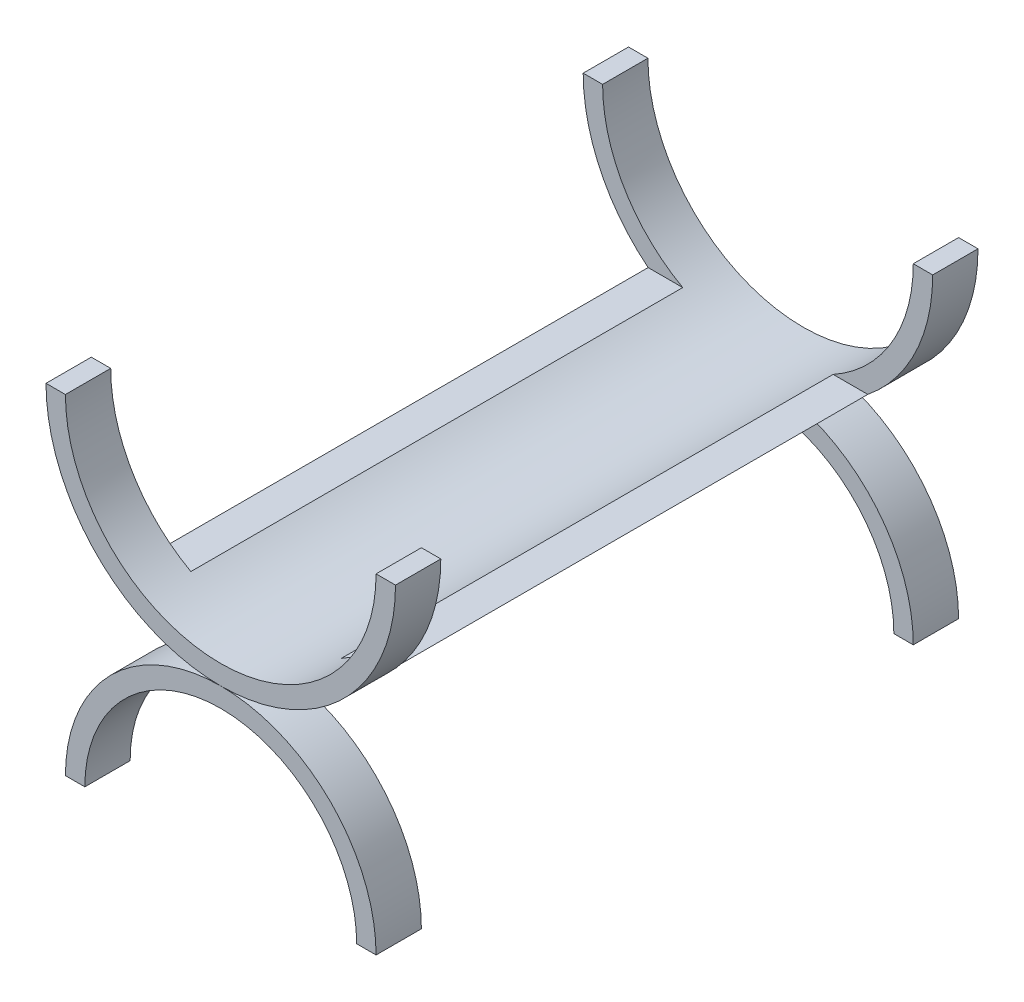
ISO-10303-21;
HEADER;
FILE_DESCRIPTION(('STEP AP214'),'2;1');
FILE_NAME('part.step','',(''),(''),'','','');
FILE_SCHEMA(('AUTOMOTIVE_DESIGN { 1 0 10303 214 1 1 1 1 }'));
ENDSEC;
DATA;
#1=APPLICATION_CONTEXT('core data for automotive mechanical design processes');
#2=APPLICATION_PROTOCOL_DEFINITION('international standard','automotive_design',2000,#1);
#3=PRODUCT_CONTEXT('',#1,'mechanical');
#4=PRODUCT('Part','Part','',(#3));
#5=PRODUCT_RELATED_PRODUCT_CATEGORY('part','',(#4));
#6=PRODUCT_DEFINITION_FORMATION('','',#4);
#7=PRODUCT_DEFINITION_CONTEXT('part definition',#1,'design');
#8=PRODUCT_DEFINITION('design','',#6,#7);
#9=PRODUCT_DEFINITION_SHAPE('','',#8);
#10=(LENGTH_UNIT() NAMED_UNIT(*) SI_UNIT(.MILLI.,.METRE.));
#11=(NAMED_UNIT(*) PLANE_ANGLE_UNIT() SI_UNIT($,.RADIAN.));
#12=(NAMED_UNIT(*) SI_UNIT($,.STERADIAN.) SOLID_ANGLE_UNIT());
#13=UNCERTAINTY_MEASURE_WITH_UNIT(LENGTH_MEASURE(1.E-05),#10,'distance_accuracy_value','');
#14=(GEOMETRIC_REPRESENTATION_CONTEXT(3) GLOBAL_UNCERTAINTY_ASSIGNED_CONTEXT((#13)) GLOBAL_UNIT_ASSIGNED_CONTEXT((#10,
#11,#12)) REPRESENTATION_CONTEXT('',''));
#15=CARTESIAN_POINT('',(0.,0.,0.));
#16=DIRECTION('',(0.,0.,1.));
#17=DIRECTION('',(1.,0.,0.));
#18=AXIS2_PLACEMENT_3D('',#15,#16,#17);
#19=CARTESIAN_POINT('',(0.,-647.7,-482.6));
#20=DIRECTION('',(0.,0.,-1.));
#21=DIRECTION('',(1.,0.,0.));
#22=AXIS2_PLACEMENT_3D('',#19,#20,#21);
#23=CYLINDRICAL_SURFACE('',#22,304.8);
#24=CARTESIAN_POINT('',(0.,-647.7,-571.5));
#25=DIRECTION('',(0.,0.,1.));
#26=DIRECTION('',(-1.,0.,0.));
#27=AXIS2_PLACEMENT_3D('',#24,#25,#26);
#28=CIRCLE('',#27,304.8);
#29=CARTESIAN_POINT('',(304.8,-647.7,-571.5));
#30=VERTEX_POINT('',#29);
#31=CARTESIAN_POINT('',(-304.8,-647.7,-571.5));
#32=VERTEX_POINT('',#31);
#33=EDGE_CURVE('E120',#30,#32,#28,.T.);
#34=ORIENTED_EDGE('',*,*,#33,.T.);
#35=DIRECTION('',(0.,0.,-1.));
#36=VECTOR('',#35,1.);
#37=CARTESIAN_POINT('',(-304.8,-647.7,-482.6));
#38=LINE('',#37,#36);
#39=CARTESIAN_POINT('',(-304.8,-647.7,-482.6));
#40=VERTEX_POINT('',#39);
#41=EDGE_CURVE('E59',#40,#32,#38,.T.);
#42=ORIENTED_EDGE('',*,*,#41,.F.);
#43=CARTESIAN_POINT('',(0.,-647.7,-482.6));
#44=DIRECTION('',(0.,0.,1.));
#45=DIRECTION('',(-1.,0.,0.));
#46=AXIS2_PLACEMENT_3D('',#43,#44,#45);
#47=CIRCLE('',#46,304.8);
#48=CARTESIAN_POINT('',(304.8,-647.7,-482.6));
#49=VERTEX_POINT('',#48);
#50=EDGE_CURVE('E109',#49,#40,#47,.T.);
#51=ORIENTED_EDGE('',*,*,#50,.F.);
#52=DIRECTION('',(0.,0.,-1.));
#53=VECTOR('',#52,1.);
#54=CARTESIAN_POINT('',(304.8,-647.7,-482.6));
#55=LINE('',#54,#53);
#56=EDGE_CURVE('E12',#49,#30,#55,.T.);
#57=ORIENTED_EDGE('',*,*,#56,.T.);
#58=EDGE_LOOP('',(#34,#42,#51,#57));
#59=FACE_BOUND('',#58,.T.);
#60=ADVANCED_FACE('F56',(#59),#23,.T.);
#61=CARTESIAN_POINT('',(266.7,-647.7,-482.6));
#62=DIRECTION('',(0.,-1.,0.));
#63=DIRECTION('',(0.,0.,1.));
#64=AXIS2_PLACEMENT_3D('',#61,#62,#63);
#65=PLANE('',#64);
#66=DIRECTION('',(1.,0.,0.));
#67=VECTOR('',#66,1.);
#68=CARTESIAN_POINT('',(266.7,-647.7,-571.5));
#69=LINE('',#68,#67);
#70=CARTESIAN_POINT('',(266.7,-647.7,-571.5));
#71=VERTEX_POINT('',#70);
#72=EDGE_CURVE('E97',#71,#30,#69,.T.);
#73=ORIENTED_EDGE('',*,*,#72,.T.);
#74=ORIENTED_EDGE('',*,*,#56,.F.);
#75=DIRECTION('',(1.,0.,0.));
#76=VECTOR('',#75,1.);
#77=CARTESIAN_POINT('',(266.7,-647.7,-482.6));
#78=LINE('',#77,#76);
#79=CARTESIAN_POINT('',(266.7,-647.7,-482.6));
#80=VERTEX_POINT('',#79);
#81=EDGE_CURVE('E74',#80,#49,#78,.T.);
#82=ORIENTED_EDGE('',*,*,#81,.F.);
#83=DIRECTION('',(0.,0.,-1.));
#84=VECTOR('',#83,1.);
#85=CARTESIAN_POINT('',(266.7,-647.7,-482.6));
#86=LINE('',#85,#84);
#87=EDGE_CURVE('E65',#80,#71,#86,.T.);
#88=ORIENTED_EDGE('',*,*,#87,.T.);
#89=EDGE_LOOP('',(#73,#74,#82,#88));
#90=FACE_BOUND('',#89,.T.);
#91=ADVANCED_FACE('F126',(#90),#65,.T.);
#92=CARTESIAN_POINT('',(0.,-647.7,-482.6));
#93=DIRECTION('',(0.,0.,-1.));
#94=DIRECTION('',(1.,0.,0.));
#95=AXIS2_PLACEMENT_3D('',#92,#93,#94);
#96=CYLINDRICAL_SURFACE('',#95,266.7);
#97=CARTESIAN_POINT('',(0.,-647.7,-571.5));
#98=DIRECTION('',(0.,0.,-1.));
#99=DIRECTION('',(-1.,0.,0.));
#100=AXIS2_PLACEMENT_3D('',#97,#98,#99);
#101=CIRCLE('',#100,266.7);
#102=CARTESIAN_POINT('',(-266.7,-647.7,-571.5));
#103=VERTEX_POINT('',#102);
#104=EDGE_CURVE('E91',#103,#71,#101,.T.);
#105=ORIENTED_EDGE('',*,*,#104,.T.);
#106=ORIENTED_EDGE('',*,*,#87,.F.);
#107=CARTESIAN_POINT('',(0.,-647.7,-482.6));
#108=DIRECTION('',(0.,0.,-1.));
#109=DIRECTION('',(-1.,0.,0.));
#110=AXIS2_PLACEMENT_3D('',#107,#108,#109);
#111=CIRCLE('',#110,266.7);
#112=CARTESIAN_POINT('',(-266.7,-647.7,-482.6));
#113=VERTEX_POINT('',#112);
#114=EDGE_CURVE('E107',#113,#80,#111,.T.);
#115=ORIENTED_EDGE('',*,*,#114,.F.);
#116=DIRECTION('',(0.,0.,-1.));
#117=VECTOR('',#116,1.);
#118=CARTESIAN_POINT('',(-266.7,-647.7,-482.6));
#119=LINE('',#118,#117);
#120=EDGE_CURVE('E112',#113,#103,#119,.T.);
#121=ORIENTED_EDGE('',*,*,#120,.T.);
#122=EDGE_LOOP('',(#105,#106,#115,#121));
#123=FACE_BOUND('',#122,.T.);
#124=ADVANCED_FACE('F115',(#123),#96,.F.);
#125=CARTESIAN_POINT('',(-304.8,-647.7,-482.6));
#126=DIRECTION('',(0.,-1.,0.));
#127=DIRECTION('',(0.,0.,1.));
#128=AXIS2_PLACEMENT_3D('',#125,#126,#127);
#129=PLANE('',#128);
#130=DIRECTION('',(1.,0.,0.));
#131=VECTOR('',#130,1.);
#132=CARTESIAN_POINT('',(-304.8,-647.7,-571.5));
#133=LINE('',#132,#131);
#134=EDGE_CURVE('E114',#32,#103,#133,.T.);
#135=ORIENTED_EDGE('',*,*,#134,.T.);
#136=ORIENTED_EDGE('',*,*,#120,.F.);
#137=DIRECTION('',(1.,0.,0.));
#138=VECTOR('',#137,1.);
#139=CARTESIAN_POINT('',(-304.8,-647.7,-482.6));
#140=LINE('',#139,#138);
#141=EDGE_CURVE('E104',#40,#113,#140,.T.);
#142=ORIENTED_EDGE('',*,*,#141,.F.);
#143=ORIENTED_EDGE('',*,*,#41,.T.);
#144=EDGE_LOOP('',(#135,#136,#142,#143));
#145=FACE_BOUND('',#144,.T.);
#146=ADVANCED_FACE('F113',(#145),#129,.T.);
#147=CARTESIAN_POINT('',(0.,-647.7,-482.6));
#148=DIRECTION('',(0.,0.,1.));
#149=DIRECTION('',(-1.,0.,0.));
#150=AXIS2_PLACEMENT_3D('',#147,#148,#149);
#151=PLANE('',#150);
#152=ORIENTED_EDGE('',*,*,#50,.T.);
#153=ORIENTED_EDGE('',*,*,#141,.T.);
#154=ORIENTED_EDGE('',*,*,#114,.T.);
#155=ORIENTED_EDGE('',*,*,#81,.T.);
#156=EDGE_LOOP('',(#152,#153,#154,#155));
#157=FACE_BOUND('',#156,.T.);
#158=ADVANCED_FACE('F105',(#157),#151,.T.);
#159=CARTESIAN_POINT('',(0.,-647.7,-571.5));
#160=DIRECTION('',(0.,0.,1.));
#161=DIRECTION('',(-1.,0.,0.));
#162=AXIS2_PLACEMENT_3D('',#159,#160,#161);
#163=PLANE('',#162);
#164=ORIENTED_EDGE('',*,*,#33,.F.);
#165=ORIENTED_EDGE('',*,*,#72,.F.);
#166=ORIENTED_EDGE('',*,*,#104,.F.);
#167=ORIENTED_EDGE('',*,*,#134,.F.);
#168=EDGE_LOOP('',(#164,#165,#166,#167));
#169=FACE_BOUND('',#168,.T.);
#170=ADVANCED_FACE('F129',(#169),#163,.F.);
#171=CLOSED_SHELL('',(#60,#91,#124,#146,#158,#170));
#172=MANIFOLD_SOLID_BREP('B2',#171);
#173=CARTESIAN_POINT('',(0.,-647.7,482.6));
#174=DIRECTION('',(0.,0.,1.));
#175=DIRECTION('',(1.,0.,0.));
#176=AXIS2_PLACEMENT_3D('',#173,#174,#175);
#177=CYLINDRICAL_SURFACE('',#176,304.8);
#178=CARTESIAN_POINT('',(0.,-647.7,571.5));
#179=DIRECTION('',(0.,0.,1.));
#180=DIRECTION('',(-1.,0.,0.));
#181=AXIS2_PLACEMENT_3D('',#178,#179,#180);
#182=CIRCLE('',#181,304.8);
#183=CARTESIAN_POINT('',(304.8,-647.7,571.5));
#184=VERTEX_POINT('',#183);
#185=CARTESIAN_POINT('',(-304.8,-647.7,571.5));
#186=VERTEX_POINT('',#185);
#187=EDGE_CURVE('E253',#184,#186,#182,.T.);
#188=ORIENTED_EDGE('',*,*,#187,.F.);
#189=DIRECTION('',(0.,0.,1.));
#190=VECTOR('',#189,1.);
#191=CARTESIAN_POINT('',(304.8,-647.7,482.6));
#192=LINE('',#191,#190);
#193=CARTESIAN_POINT('',(304.8,-647.7,482.6));
#194=VERTEX_POINT('',#193);
#195=EDGE_CURVE('E54',#194,#184,#192,.T.);
#196=ORIENTED_EDGE('',*,*,#195,.F.);
#197=CARTESIAN_POINT('',(0.,-647.7,482.6));
#198=DIRECTION('',(0.,0.,1.));
#199=DIRECTION('',(-1.,0.,0.));
#200=AXIS2_PLACEMENT_3D('',#197,#198,#199);
#201=CIRCLE('',#200,304.8);
#202=CARTESIAN_POINT('',(-304.8,-647.7,482.6));
#203=VERTEX_POINT('',#202);
#204=EDGE_CURVE('E247',#194,#203,#201,.T.);
#205=ORIENTED_EDGE('',*,*,#204,.T.);
#206=DIRECTION('',(0.,0.,1.));
#207=VECTOR('',#206,1.);
#208=CARTESIAN_POINT('',(-304.8,-647.7,482.6));
#209=LINE('',#208,#207);
#210=EDGE_CURVE('E192',#203,#186,#209,.T.);
#211=ORIENTED_EDGE('',*,*,#210,.T.);
#212=EDGE_LOOP('',(#188,#196,#205,#211));
#213=FACE_BOUND('',#212,.T.);
#214=ADVANCED_FACE('F189',(#213),#177,.T.);
#215=CARTESIAN_POINT('',(266.7,-647.7,482.6));
#216=DIRECTION('',(0.,-1.,0.));
#217=DIRECTION('',(0.,0.,-1.));
#218=AXIS2_PLACEMENT_3D('',#215,#216,#217);
#219=PLANE('',#218);
#220=DIRECTION('',(1.,0.,0.));
#221=VECTOR('',#220,1.);
#222=CARTESIAN_POINT('',(266.7,-647.7,571.5));
#223=LINE('',#222,#221);
#224=CARTESIAN_POINT('',(266.7,-647.7,571.5));
#225=VERTEX_POINT('',#224);
#226=EDGE_CURVE('E249',#225,#184,#223,.T.);
#227=ORIENTED_EDGE('',*,*,#226,.F.);
#228=DIRECTION('',(0.,0.,1.));
#229=VECTOR('',#228,1.);
#230=CARTESIAN_POINT('',(266.7,-647.7,482.6));
#231=LINE('',#230,#229);
#232=CARTESIAN_POINT('',(266.7,-647.7,482.6));
#233=VERTEX_POINT('',#232);
#234=EDGE_CURVE('E198',#233,#225,#231,.T.);
#235=ORIENTED_EDGE('',*,*,#234,.F.);
#236=DIRECTION('',(1.,0.,0.));
#237=VECTOR('',#236,1.);
#238=CARTESIAN_POINT('',(266.7,-647.7,482.6));
#239=LINE('',#238,#237);
#240=EDGE_CURVE('E244',#233,#194,#239,.T.);
#241=ORIENTED_EDGE('',*,*,#240,.T.);
#242=ORIENTED_EDGE('',*,*,#195,.T.);
#243=EDGE_LOOP('',(#227,#235,#241,#242));
#244=FACE_BOUND('',#243,.T.);
#245=ADVANCED_FACE('F263',(#244),#219,.T.);
#246=CARTESIAN_POINT('',(0.,-647.7,482.6));
#247=DIRECTION('',(0.,0.,1.));
#248=DIRECTION('',(1.,0.,0.));
#249=AXIS2_PLACEMENT_3D('',#246,#247,#248);
#250=CYLINDRICAL_SURFACE('',#249,266.7);
#251=CARTESIAN_POINT('',(0.,-647.7,571.5));
#252=DIRECTION('',(0.,0.,-1.));
#253=DIRECTION('',(-1.,0.,0.));
#254=AXIS2_PLACEMENT_3D('',#251,#252,#253);
#255=CIRCLE('',#254,266.7);
#256=CARTESIAN_POINT('',(-266.7,-647.7,571.5));
#257=VERTEX_POINT('',#256);
#258=EDGE_CURVE('E239',#257,#225,#255,.T.);
#259=ORIENTED_EDGE('',*,*,#258,.F.);
#260=DIRECTION('',(0.,0.,1.));
#261=VECTOR('',#260,1.);
#262=CARTESIAN_POINT('',(-266.7,-647.7,482.6));
#263=LINE('',#262,#261);
#264=CARTESIAN_POINT('',(-266.7,-647.7,482.6));
#265=VERTEX_POINT('',#264);
#266=EDGE_CURVE('E234',#265,#257,#263,.T.);
#267=ORIENTED_EDGE('',*,*,#266,.F.);
#268=CARTESIAN_POINT('',(0.,-647.7,482.6));
#269=DIRECTION('',(0.,0.,-1.));
#270=DIRECTION('',(-1.,0.,0.));
#271=AXIS2_PLACEMENT_3D('',#268,#269,#270);
#272=CIRCLE('',#271,266.7);
#273=EDGE_CURVE('E237',#265,#233,#272,.T.);
#274=ORIENTED_EDGE('',*,*,#273,.T.);
#275=ORIENTED_EDGE('',*,*,#234,.T.);
#276=EDGE_LOOP('',(#259,#267,#274,#275));
#277=FACE_BOUND('',#276,.T.);
#278=ADVANCED_FACE('F236',(#277),#250,.F.);
#279=CARTESIAN_POINT('',(-304.8,-647.7,482.6));
#280=DIRECTION('',(0.,-1.,0.));
#281=DIRECTION('',(0.,0.,-1.));
#282=AXIS2_PLACEMENT_3D('',#279,#280,#281);
#283=PLANE('',#282);
#284=DIRECTION('',(1.,0.,0.));
#285=VECTOR('',#284,1.);
#286=CARTESIAN_POINT('',(-304.8,-647.7,571.5));
#287=LINE('',#286,#285);
#288=EDGE_CURVE('E256',#186,#257,#287,.T.);
#289=ORIENTED_EDGE('',*,*,#288,.F.);
#290=ORIENTED_EDGE('',*,*,#210,.F.);
#291=DIRECTION('',(1.,0.,0.));
#292=VECTOR('',#291,1.);
#293=CARTESIAN_POINT('',(-304.8,-647.7,482.6));
#294=LINE('',#293,#292);
#295=EDGE_CURVE('E243',#203,#265,#294,.T.);
#296=ORIENTED_EDGE('',*,*,#295,.T.);
#297=ORIENTED_EDGE('',*,*,#266,.T.);
#298=EDGE_LOOP('',(#289,#290,#296,#297));
#299=FACE_BOUND('',#298,.T.);
#300=ADVANCED_FACE('F246',(#299),#283,.T.);
#301=CARTESIAN_POINT('',(0.,-647.7,482.6));
#302=DIRECTION('',(0.,0.,-1.));
#303=DIRECTION('',(-1.,0.,0.));
#304=AXIS2_PLACEMENT_3D('',#301,#302,#303);
#305=PLANE('',#304);
#306=ORIENTED_EDGE('',*,*,#204,.F.);
#307=ORIENTED_EDGE('',*,*,#240,.F.);
#308=ORIENTED_EDGE('',*,*,#273,.F.);
#309=ORIENTED_EDGE('',*,*,#295,.F.);
#310=EDGE_LOOP('',(#306,#307,#308,#309));
#311=FACE_BOUND('',#310,.T.);
#312=ADVANCED_FACE('F242',(#311),#305,.T.);
#313=CARTESIAN_POINT('',(0.,-647.7,571.5));
#314=DIRECTION('',(0.,0.,-1.));
#315=DIRECTION('',(-1.,0.,0.));
#316=AXIS2_PLACEMENT_3D('',#313,#314,#315);
#317=PLANE('',#316);
#318=ORIENTED_EDGE('',*,*,#187,.T.);
#319=ORIENTED_EDGE('',*,*,#288,.T.);
#320=ORIENTED_EDGE('',*,*,#258,.T.);
#321=ORIENTED_EDGE('',*,*,#226,.T.);
#322=EDGE_LOOP('',(#318,#319,#320,#321));
#323=FACE_BOUND('',#322,.T.);
#324=ADVANCED_FACE('F262',(#323),#317,.F.);
#325=CLOSED_SHELL('',(#214,#245,#278,#300,#312,#324));
#326=MANIFOLD_SOLID_BREP('B6',#325);
#327=CARTESIAN_POINT('',(304.8,0.,-571.5));
#328=DIRECTION('',(0.,1.,0.));
#329=DIRECTION('',(-1.,0.,0.));
#330=AXIS2_PLACEMENT_3D('',#327,#328,#329);
#331=PLANE('',#330);
#332=DIRECTION('',(1.,0.,0.));
#333=VECTOR('',#332,1.);
#334=CARTESIAN_POINT('',(-342.9,0.,482.6));
#335=LINE('',#334,#333);
#336=CARTESIAN_POINT('',(304.8,0.,482.6));
#337=VERTEX_POINT('',#336);
#338=CARTESIAN_POINT('',(342.9,0.,482.6));
#339=VERTEX_POINT('',#338);
#340=EDGE_CURVE('E523',#337,#339,#335,.T.);
#341=ORIENTED_EDGE('',*,*,#340,.F.);
#342=DIRECTION('',(0.,0.,1.));
#343=VECTOR('',#342,1.);
#344=CARTESIAN_POINT('',(304.8,0.,-571.5));
#345=LINE('',#344,#343);
#346=CARTESIAN_POINT('',(304.8,0.,571.5));
#347=VERTEX_POINT('',#346);
#348=EDGE_CURVE('E434',#337,#347,#345,.T.);
#349=ORIENTED_EDGE('',*,*,#348,.T.);
#350=DIRECTION('',(-1.,0.,0.));
#351=VECTOR('',#350,1.);
#352=CARTESIAN_POINT('',(304.8,0.,571.5));
#353=LINE('',#352,#351);
#354=CARTESIAN_POINT('',(342.9,0.,571.5));
#355=VERTEX_POINT('',#354);
#356=EDGE_CURVE('E495',#355,#347,#353,.T.);
#357=ORIENTED_EDGE('',*,*,#356,.F.);
#358=DIRECTION('',(0.,0.,1.));
#359=VECTOR('',#358,1.);
#360=CARTESIAN_POINT('',(342.9,0.,-571.5));
#361=LINE('',#360,#359);
#362=EDGE_CURVE('E435',#339,#355,#361,.T.);
#363=ORIENTED_EDGE('',*,*,#362,.F.);
#364=EDGE_LOOP('',(#341,#349,#357,#363));
#365=FACE_BOUND('',#364,.T.);
#366=ADVANCED_FACE('F313',(#365),#331,.T.);
#367=CARTESIAN_POINT('',(-342.9,0.,-571.5));
#368=DIRECTION('',(0.,1.,0.));
#369=DIRECTION('',(-1.,0.,0.));
#370=AXIS2_PLACEMENT_3D('',#367,#368,#369);
#371=PLANE('',#370);
#372=CARTESIAN_POINT('',(-342.9,0.,482.6));
#373=VERTEX_POINT('',#372);
#374=CARTESIAN_POINT('',(-304.8,0.,482.6));
#375=VERTEX_POINT('',#374);
#376=EDGE_CURVE('E415',#373,#375,#335,.T.);
#377=ORIENTED_EDGE('',*,*,#376,.F.);
#378=DIRECTION('',(0.,0.,1.));
#379=VECTOR('',#378,1.);
#380=CARTESIAN_POINT('',(-342.9,0.,-571.5));
#381=LINE('',#380,#379);
#382=CARTESIAN_POINT('',(-342.9,0.,571.5));
#383=VERTEX_POINT('',#382);
#384=EDGE_CURVE('E446',#373,#383,#381,.T.);
#385=ORIENTED_EDGE('',*,*,#384,.T.);
#386=DIRECTION('',(-1.,0.,0.));
#387=VECTOR('',#386,1.);
#388=CARTESIAN_POINT('',(-342.9,0.,571.5));
#389=LINE('',#388,#387);
#390=CARTESIAN_POINT('',(-304.8,0.,571.5));
#391=VERTEX_POINT('',#390);
#392=EDGE_CURVE('E507',#391,#383,#389,.T.);
#393=ORIENTED_EDGE('',*,*,#392,.F.);
#394=DIRECTION('',(0.,0.,1.));
#395=VECTOR('',#394,1.);
#396=CARTESIAN_POINT('',(-304.8,0.,-571.5));
#397=LINE('',#396,#395);
#398=EDGE_CURVE('E450',#375,#391,#397,.T.);
#399=ORIENTED_EDGE('',*,*,#398,.F.);
#400=EDGE_LOOP('',(#377,#385,#393,#399));
#401=FACE_BOUND('',#400,.T.);
#402=ADVANCED_FACE('F530',(#401),#371,.T.);
#403=CARTESIAN_POINT('',(0.,0.,-571.5));
#404=DIRECTION('',(0.,0.,1.));
#405=DIRECTION('',(1.,0.,0.));
#406=AXIS2_PLACEMENT_3D('',#403,#404,#405);
#407=CYLINDRICAL_SURFACE('',#406,304.8);
#408=CARTESIAN_POINT('',(0.,0.,482.6));
#409=DIRECTION('',(0.,0.,1.));
#410=DIRECTION('',(0.,-1.,0.));
#411=AXIS2_PLACEMENT_3D('',#408,#409,#410);
#412=CIRCLE('',#411,304.8);
#413=CARTESIAN_POINT('',(147.560665490503,-266.7,482.6));
#414=VERTEX_POINT('',#413);
#415=EDGE_CURVE('E478',#414,#337,#412,.T.);
#416=ORIENTED_EDGE('',*,*,#415,.F.);
#417=DIRECTION('',(0.,0.,1.));
#418=VECTOR('',#417,1.);
#419=CARTESIAN_POINT('',(147.560665490503,-266.7,-571.5));
#420=LINE('',#419,#418);
#421=CARTESIAN_POINT('',(147.560665490503,-266.7,-482.6));
#422=VERTEX_POINT('',#421);
#423=EDGE_CURVE('E486',#422,#414,#420,.T.);
#424=ORIENTED_EDGE('',*,*,#423,.F.);
#425=CARTESIAN_POINT('',(0.,0.,-482.6));
#426=DIRECTION('',(0.,0.,-1.));
#427=DIRECTION('',(0.,1.,0.));
#428=AXIS2_PLACEMENT_3D('',#425,#426,#427);
#429=CIRCLE('',#428,304.8);
#430=CARTESIAN_POINT('',(304.8,0.,-482.6));
#431=VERTEX_POINT('',#430);
#432=EDGE_CURVE('E480',#431,#422,#429,.T.);
#433=ORIENTED_EDGE('',*,*,#432,.F.);
#434=CARTESIAN_POINT('',(304.8,0.,-571.5));
#435=VERTEX_POINT('',#434);
#436=EDGE_CURVE('E423',#435,#431,#345,.T.);
#437=ORIENTED_EDGE('',*,*,#436,.F.);
#438=CARTESIAN_POINT('',(0.,0.,-571.5));
#439=DIRECTION('',(0.,0.,-1.));
#440=DIRECTION('',(1.,0.,0.));
#441=AXIS2_PLACEMENT_3D('',#438,#439,#440);
#442=CIRCLE('',#441,304.8);
#443=CARTESIAN_POINT('',(-304.8,0.,-571.5));
#444=VERTEX_POINT('',#443);
#445=EDGE_CURVE('E490',#435,#444,#442,.T.);
#446=ORIENTED_EDGE('',*,*,#445,.T.);
#447=CARTESIAN_POINT('',(-304.8,0.,-482.6));
#448=VERTEX_POINT('',#447);
#449=EDGE_CURVE('E447',#444,#448,#397,.T.);
#450=ORIENTED_EDGE('',*,*,#449,.T.);
#451=CARTESIAN_POINT('',(-147.560665490503,-266.7,-482.6));
#452=VERTEX_POINT('',#451);
#453=EDGE_CURVE('E336',#452,#448,#429,.T.);
#454=ORIENTED_EDGE('',*,*,#453,.F.);
#455=DIRECTION('',(0.,0.,1.));
#456=VECTOR('',#455,1.);
#457=CARTESIAN_POINT('',(-147.560665490503,-266.7,-571.5));
#458=LINE('',#457,#456);
#459=CARTESIAN_POINT('',(-147.560665490503,-266.7,482.6));
#460=VERTEX_POINT('',#459);
#461=EDGE_CURVE('E483',#460,#452,#458,.F.);
#462=ORIENTED_EDGE('',*,*,#461,.F.);
#463=EDGE_CURVE('E468',#375,#460,#412,.T.);
#464=ORIENTED_EDGE('',*,*,#463,.F.);
#465=ORIENTED_EDGE('',*,*,#398,.T.);
#466=CARTESIAN_POINT('',(0.,0.,571.5));
#467=DIRECTION('',(0.,0.,-1.));
#468=DIRECTION('',(1.,0.,0.));
#469=AXIS2_PLACEMENT_3D('',#466,#467,#468);
#470=CIRCLE('',#469,304.8);
#471=EDGE_CURVE('E489',#347,#391,#470,.T.);
#472=ORIENTED_EDGE('',*,*,#471,.F.);
#473=ORIENTED_EDGE('',*,*,#348,.F.);
#474=EDGE_LOOP('',(#416,#424,#433,#437,#446,#450,#454,#462,#464,#465,#472,#473));
#475=FACE_BOUND('',#474,.T.);
#476=ADVANCED_FACE('F315',(#475),#407,.F.);
#477=DIRECTION('',(1.,0.,0.));
#478=VECTOR('',#477,1.);
#479=CARTESIAN_POINT('',(-342.9,0.,-482.6));
#480=LINE('',#479,#478);
#481=CARTESIAN_POINT('',(342.9,0.,-482.6));
#482=VERTEX_POINT('',#481);
#483=EDGE_CURVE('E406',#431,#482,#480,.T.);
#484=ORIENTED_EDGE('',*,*,#483,.T.);
#485=CARTESIAN_POINT('',(342.9,0.,-571.5));
#486=VERTEX_POINT('',#485);
#487=EDGE_CURVE('E421',#486,#482,#361,.T.);
#488=ORIENTED_EDGE('',*,*,#487,.F.);
#489=DIRECTION('',(-1.,0.,0.));
#490=VECTOR('',#489,1.);
#491=CARTESIAN_POINT('',(304.8,0.,-571.5));
#492=LINE('',#491,#490);
#493=EDGE_CURVE('E501',#486,#435,#492,.T.);
#494=ORIENTED_EDGE('',*,*,#493,.T.);
#495=ORIENTED_EDGE('',*,*,#436,.T.);
#496=EDGE_LOOP('',(#484,#488,#494,#495));
#497=FACE_BOUND('',#496,.T.);
#498=ADVANCED_FACE('F419',(#497),#331,.T.);
#499=CARTESIAN_POINT('',(0.,0.,-571.5));
#500=DIRECTION('',(0.,0.,1.));
#501=DIRECTION('',(1.,0.,0.));
#502=AXIS2_PLACEMENT_3D('',#499,#500,#501);
#503=CYLINDRICAL_SURFACE('',#502,342.9);
#504=ORIENTED_EDGE('',*,*,#362,.T.);
#505=CARTESIAN_POINT('',(0.,0.,571.5));
#506=DIRECTION('',(0.,0.,1.));
#507=DIRECTION('',(1.,0.,0.));
#508=AXIS2_PLACEMENT_3D('',#505,#506,#507);
#509=CIRCLE('',#508,342.9);
#510=EDGE_CURVE('E511',#383,#355,#509,.T.);
#511=ORIENTED_EDGE('',*,*,#510,.F.);
#512=ORIENTED_EDGE('',*,*,#384,.F.);
#513=CARTESIAN_POINT('',(0.,0.,482.6));
#514=DIRECTION('',(0.,0.,1.));
#515=DIRECTION('',(0.,-1.,0.));
#516=AXIS2_PLACEMENT_3D('',#513,#514,#515);
#517=CIRCLE('',#516,342.9);
#518=CARTESIAN_POINT('',(-215.52614690566,-266.7,482.6));
#519=VERTEX_POINT('',#518);
#520=EDGE_CURVE('E465',#519,#373,#517,.F.);
#521=ORIENTED_EDGE('',*,*,#520,.F.);
#522=DIRECTION('',(0.,0.,1.));
#523=VECTOR('',#522,1.);
#524=CARTESIAN_POINT('',(-215.52614690566,-266.7,-571.5));
#525=LINE('',#524,#523);
#526=CARTESIAN_POINT('',(-215.52614690566,-266.7,-482.6));
#527=VERTEX_POINT('',#526);
#528=EDGE_CURVE('E322',#527,#519,#525,.T.);
#529=ORIENTED_EDGE('',*,*,#528,.F.);
#530=CARTESIAN_POINT('',(0.,0.,-482.6));
#531=DIRECTION('',(0.,0.,-1.));
#532=DIRECTION('',(0.,1.,0.));
#533=AXIS2_PLACEMENT_3D('',#530,#531,#532);
#534=CIRCLE('',#533,342.9);
#535=CARTESIAN_POINT('',(-342.9,0.,-482.6));
#536=VERTEX_POINT('',#535);
#537=EDGE_CURVE('E414',#536,#527,#534,.F.);
#538=ORIENTED_EDGE('',*,*,#537,.F.);
#539=CARTESIAN_POINT('',(-342.9,0.,-571.5));
#540=VERTEX_POINT('',#539);
#541=EDGE_CURVE('E440',#540,#536,#381,.T.);
#542=ORIENTED_EDGE('',*,*,#541,.F.);
#543=CARTESIAN_POINT('',(0.,0.,-571.5));
#544=DIRECTION('',(0.,0.,1.));
#545=DIRECTION('',(1.,0.,0.));
#546=AXIS2_PLACEMENT_3D('',#543,#544,#545);
#547=CIRCLE('',#546,342.9);
#548=EDGE_CURVE('E431',#540,#486,#547,.T.);
#549=ORIENTED_EDGE('',*,*,#548,.T.);
#550=ORIENTED_EDGE('',*,*,#487,.T.);
#551=CARTESIAN_POINT('',(215.52614690566,-266.7,-482.6));
#552=VERTEX_POINT('',#551);
#553=EDGE_CURVE('E403',#552,#482,#534,.F.);
#554=ORIENTED_EDGE('',*,*,#553,.F.);
#555=DIRECTION('',(0.,0.,1.));
#556=VECTOR('',#555,1.);
#557=CARTESIAN_POINT('',(215.52614690566,-266.7,-571.5));
#558=LINE('',#557,#556);
#559=CARTESIAN_POINT('',(215.52614690566,-266.7,482.6));
#560=VERTEX_POINT('',#559);
#561=EDGE_CURVE('E187',#560,#552,#558,.F.);
#562=ORIENTED_EDGE('',*,*,#561,.F.);
#563=EDGE_CURVE('E474',#339,#560,#517,.F.);
#564=ORIENTED_EDGE('',*,*,#563,.F.);
#565=EDGE_LOOP('',(#504,#511,#512,#521,#529,#538,#542,#549,#550,#554,#562,#564));
#566=FACE_BOUND('',#565,.T.);
#567=ADVANCED_FACE('F429',(#566),#503,.T.);
#568=EDGE_CURVE('E425',#536,#448,#480,.T.);
#569=ORIENTED_EDGE('',*,*,#568,.T.);
#570=ORIENTED_EDGE('',*,*,#449,.F.);
#571=DIRECTION('',(-1.,0.,0.));
#572=VECTOR('',#571,1.);
#573=CARTESIAN_POINT('',(-342.9,0.,-571.5));
#574=LINE('',#573,#572);
#575=EDGE_CURVE('E494',#444,#540,#574,.T.);
#576=ORIENTED_EDGE('',*,*,#575,.T.);
#577=ORIENTED_EDGE('',*,*,#541,.T.);
#578=EDGE_LOOP('',(#569,#570,#576,#577));
#579=FACE_BOUND('',#578,.T.);
#580=ADVANCED_FACE('F564',(#579),#371,.T.);
#581=CARTESIAN_POINT('',(0.,0.,-571.5));
#582=DIRECTION('',(0.,0.,1.));
#583=DIRECTION('',(1.,0.,0.));
#584=AXIS2_PLACEMENT_3D('',#581,#582,#583);
#585=PLANE('',#584);
#586=ORIENTED_EDGE('',*,*,#445,.F.);
#587=ORIENTED_EDGE('',*,*,#493,.F.);
#588=ORIENTED_EDGE('',*,*,#548,.F.);
#589=ORIENTED_EDGE('',*,*,#575,.F.);
#590=EDGE_LOOP('',(#586,#587,#588,#589));
#591=FACE_BOUND('',#590,.T.);
#592=ADVANCED_FACE('F631',(#591),#585,.F.);
#593=CARTESIAN_POINT('',(0.,0.,571.5));
#594=DIRECTION('',(0.,0.,1.));
#595=DIRECTION('',(1.,0.,0.));
#596=AXIS2_PLACEMENT_3D('',#593,#594,#595);
#597=PLANE('',#596);
#598=ORIENTED_EDGE('',*,*,#471,.T.);
#599=ORIENTED_EDGE('',*,*,#392,.T.);
#600=ORIENTED_EDGE('',*,*,#510,.T.);
#601=ORIENTED_EDGE('',*,*,#356,.T.);
#602=EDGE_LOOP('',(#598,#599,#600,#601));
#603=FACE_BOUND('',#602,.T.);
#604=ADVANCED_FACE('F517',(#603),#597,.T.);
#605=CARTESIAN_POINT('',(-342.9,0.,-482.6));
#606=DIRECTION('',(0.,0.,-1.));
#607=DIRECTION('',(0.,1.,0.));
#608=AXIS2_PLACEMENT_3D('',#605,#606,#607);
#609=PLANE('',#608);
#610=ORIENTED_EDGE('',*,*,#453,.T.);
#611=ORIENTED_EDGE('',*,*,#568,.F.);
#612=ORIENTED_EDGE('',*,*,#537,.T.);
#613=DIRECTION('',(1.,0.,0.));
#614=VECTOR('',#613,1.);
#615=CARTESIAN_POINT('',(-342.9,-266.7,-482.6));
#616=LINE('',#615,#614);
#617=EDGE_CURVE('E426',#527,#452,#616,.T.);
#618=ORIENTED_EDGE('',*,*,#617,.T.);
#619=EDGE_LOOP('',(#610,#611,#612,#618));
#620=FACE_BOUND('',#619,.T.);
#621=ADVANCED_FACE('F543',(#620),#609,.F.);
#622=CARTESIAN_POINT('',(-342.9,0.,482.6));
#623=DIRECTION('',(0.,0.,1.));
#624=DIRECTION('',(0.,-1.,0.));
#625=AXIS2_PLACEMENT_3D('',#622,#623,#624);
#626=PLANE('',#625);
#627=ORIENTED_EDGE('',*,*,#463,.T.);
#628=DIRECTION('',(1.,0.,0.));
#629=VECTOR('',#628,1.);
#630=CARTESIAN_POINT('',(-342.9,-266.7,482.6));
#631=LINE('',#630,#629);
#632=EDGE_CURVE('E459',#519,#460,#631,.T.);
#633=ORIENTED_EDGE('',*,*,#632,.F.);
#634=ORIENTED_EDGE('',*,*,#520,.T.);
#635=ORIENTED_EDGE('',*,*,#376,.T.);
#636=EDGE_LOOP('',(#627,#633,#634,#635));
#637=FACE_BOUND('',#636,.T.);
#638=ADVANCED_FACE('F464',(#637),#626,.F.);
#639=CARTESIAN_POINT('',(-342.9,-266.7,482.6));
#640=DIRECTION('',(0.,-1.,0.));
#641=DIRECTION('',(0.,0.,-1.));
#642=AXIS2_PLACEMENT_3D('',#639,#640,#641);
#643=PLANE('',#642);
#644=ORIENTED_EDGE('',*,*,#461,.T.);
#645=ORIENTED_EDGE('',*,*,#617,.F.);
#646=ORIENTED_EDGE('',*,*,#528,.T.);
#647=ORIENTED_EDGE('',*,*,#632,.T.);
#648=EDGE_LOOP('',(#644,#645,#646,#647));
#649=FACE_BOUND('',#648,.T.);
#650=ADVANCED_FACE('F458',(#649),#643,.F.);
#651=ORIENTED_EDGE('',*,*,#423,.T.);
#652=EDGE_CURVE('E328',#414,#560,#631,.T.);
#653=ORIENTED_EDGE('',*,*,#652,.T.);
#654=ORIENTED_EDGE('',*,*,#561,.T.);
#655=EDGE_CURVE('E409',#422,#552,#616,.T.);
#656=ORIENTED_EDGE('',*,*,#655,.F.);
#657=EDGE_LOOP('',(#651,#653,#654,#656));
#658=FACE_BOUND('',#657,.T.);
#659=ADVANCED_FACE('F548',(#658),#643,.F.);
#660=ORIENTED_EDGE('',*,*,#415,.T.);
#661=ORIENTED_EDGE('',*,*,#340,.T.);
#662=ORIENTED_EDGE('',*,*,#563,.T.);
#663=ORIENTED_EDGE('',*,*,#652,.F.);
#664=EDGE_LOOP('',(#660,#661,#662,#663));
#665=FACE_BOUND('',#664,.T.);
#666=ADVANCED_FACE('F534',(#665),#626,.F.);
#667=ORIENTED_EDGE('',*,*,#432,.T.);
#668=ORIENTED_EDGE('',*,*,#655,.T.);
#669=ORIENTED_EDGE('',*,*,#553,.T.);
#670=ORIENTED_EDGE('',*,*,#483,.F.);
#671=EDGE_LOOP('',(#667,#668,#669,#670));
#672=FACE_BOUND('',#671,.T.);
#673=ADVANCED_FACE('F405',(#672),#609,.F.);
#674=CLOSED_SHELL('',(#366,#402,#476,#498,#567,#580,#592,#604,#621,#638,#650,#659,#666,#673));
#675=MANIFOLD_SOLID_BREP('B48',#674);
#676=ADVANCED_BREP_SHAPE_REPRESENTATION('',(#18,#172,#326,#675),#14);
#677=SHAPE_DEFINITION_REPRESENTATION(#9,#676);
ENDSEC;
END-ISO-10303-21;
